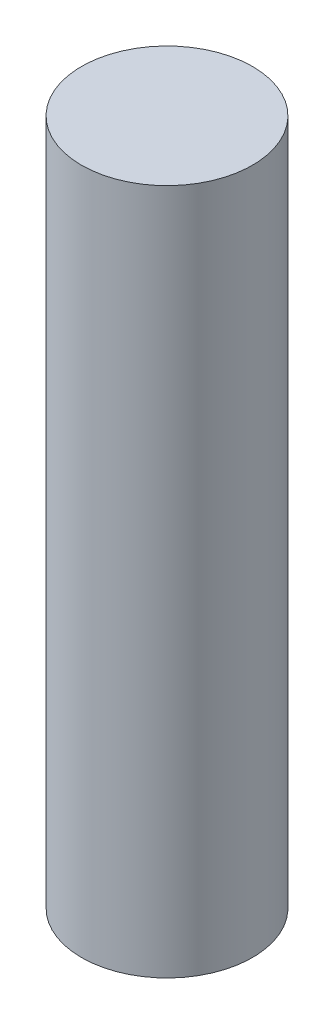
ISO-10303-21;
HEADER;
FILE_DESCRIPTION(('STEP AP214'),'2;1');
FILE_NAME('part.step','',(''),(''),'','','');
FILE_SCHEMA(('AUTOMOTIVE_DESIGN { 1 0 10303 214 1 1 1 1 }'));
ENDSEC;
DATA;
#1=APPLICATION_CONTEXT('core data for automotive mechanical design processes');
#2=APPLICATION_PROTOCOL_DEFINITION('international standard','automotive_design',2000,#1);
#3=PRODUCT_CONTEXT('',#1,'mechanical');
#4=PRODUCT('Part','Part','',(#3));
#5=PRODUCT_RELATED_PRODUCT_CATEGORY('part','',(#4));
#6=PRODUCT_DEFINITION_FORMATION('','',#4);
#7=PRODUCT_DEFINITION_CONTEXT('part definition',#1,'design');
#8=PRODUCT_DEFINITION('design','',#6,#7);
#9=PRODUCT_DEFINITION_SHAPE('','',#8);
#10=(LENGTH_UNIT() NAMED_UNIT(*) SI_UNIT(.MILLI.,.METRE.));
#11=(NAMED_UNIT(*) PLANE_ANGLE_UNIT() SI_UNIT($,.RADIAN.));
#12=(NAMED_UNIT(*) SI_UNIT($,.STERADIAN.) SOLID_ANGLE_UNIT());
#13=UNCERTAINTY_MEASURE_WITH_UNIT(LENGTH_MEASURE(1.E-05),#10,'distance_accuracy_value','');
#14=(GEOMETRIC_REPRESENTATION_CONTEXT(3) GLOBAL_UNCERTAINTY_ASSIGNED_CONTEXT((#13)) GLOBAL_UNIT_ASSIGNED_CONTEXT((#10,
#11,#12)) REPRESENTATION_CONTEXT('',''));
#15=CARTESIAN_POINT('',(0.,0.,0.));
#16=DIRECTION('',(0.,0.,1.));
#17=DIRECTION('',(1.,0.,0.));
#18=AXIS2_PLACEMENT_3D('',#15,#16,#17);
#19=CARTESIAN_POINT('',(0.,0.75,0.));
#20=DIRECTION('',(0.,-1.,0.));
#21=DIRECTION('',(0.,0.,-1.));
#22=AXIS2_PLACEMENT_3D('',#19,#20,#21);
#23=CYLINDRICAL_SURFACE('',#22,0.0935);
#24=CARTESIAN_POINT('',(0.,0.75,0.));
#25=DIRECTION('',(0.,1.,0.));
#26=DIRECTION('',(0.,0.,1.));
#27=AXIS2_PLACEMENT_3D('',#24,#25,#26);
#28=CIRCLE('',#27,0.0935);
#29=CARTESIAN_POINT('',(0.,0.75,0.0935));
#30=VERTEX_POINT('',#29);
#31=EDGE_CURVE('E10',#30,#30,#28,.T.);
#32=ORIENTED_EDGE('',*,*,#31,.F.);
#33=EDGE_LOOP('',(#32));
#34=FACE_BOUND('',#33,.T.);
#35=CARTESIAN_POINT('',(0.,0.,0.));
#36=DIRECTION('',(0.,1.,0.));
#37=DIRECTION('',(0.,0.,1.));
#38=AXIS2_PLACEMENT_3D('',#35,#36,#37);
#39=CIRCLE('',#38,0.0935);
#40=CARTESIAN_POINT('',(0.,0.,0.0935));
#41=VERTEX_POINT('',#40);
#42=EDGE_CURVE('E40',#41,#41,#39,.T.);
#43=ORIENTED_EDGE('',*,*,#42,.T.);
#44=EDGE_LOOP('',(#43));
#45=FACE_BOUND('',#44,.T.);
#46=ADVANCED_FACE('F37',(#34,#45),#23,.T.);
#47=CARTESIAN_POINT('',(0.,0.75,0.));
#48=DIRECTION('',(0.,1.,0.));
#49=DIRECTION('',(0.,0.,1.));
#50=AXIS2_PLACEMENT_3D('',#47,#48,#49);
#51=PLANE('',#50);
#52=ORIENTED_EDGE('',*,*,#31,.T.);
#53=EDGE_LOOP('',(#52));
#54=FACE_BOUND('',#53,.T.);
#55=ADVANCED_FACE('F54',(#54),#51,.T.);
#56=CARTESIAN_POINT('',(0.,0.,0.));
#57=DIRECTION('',(0.,1.,0.));
#58=DIRECTION('',(0.,0.,1.));
#59=AXIS2_PLACEMENT_3D('',#56,#57,#58);
#60=PLANE('',#59);
#61=ORIENTED_EDGE('',*,*,#42,.F.);
#62=EDGE_LOOP('',(#61));
#63=FACE_BOUND('',#62,.T.);
#64=ADVANCED_FACE('F52',(#63),#60,.F.);
#65=CLOSED_SHELL('',(#46,#55,#64));
#66=MANIFOLD_SOLID_BREP('B2',#65);
#67=ADVANCED_BREP_SHAPE_REPRESENTATION('',(#18,#66),#14);
#68=SHAPE_DEFINITION_REPRESENTATION(#9,#67);
ENDSEC;
END-ISO-10303-21;
